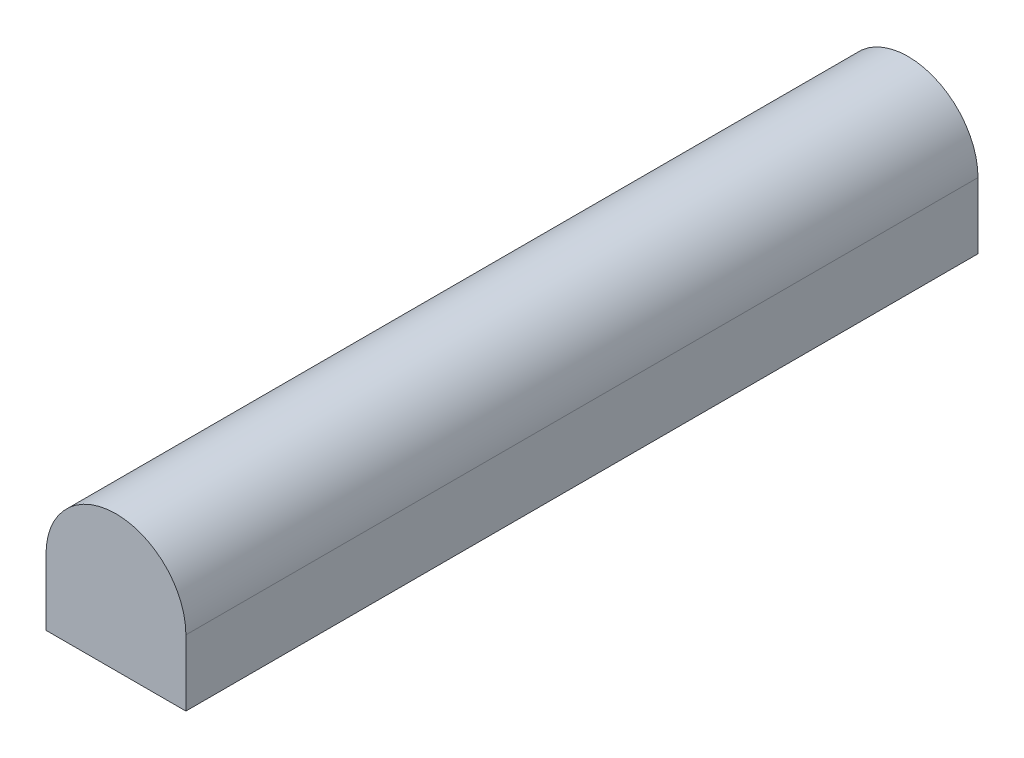
ISO-10303-21;
HEADER;
FILE_DESCRIPTION(('STEP AP214'),'2;1');
FILE_NAME('part.step','',(''),(''),'','','');
FILE_SCHEMA(('AUTOMOTIVE_DESIGN { 1 0 10303 214 1 1 1 1 }'));
ENDSEC;
DATA;
#1=APPLICATION_CONTEXT('core data for automotive mechanical design processes');
#2=APPLICATION_PROTOCOL_DEFINITION('international standard','automotive_design',2000,#1);
#3=PRODUCT_CONTEXT('',#1,'mechanical');
#4=PRODUCT('Part','Part','',(#3));
#5=PRODUCT_RELATED_PRODUCT_CATEGORY('part','',(#4));
#6=PRODUCT_DEFINITION_FORMATION('','',#4);
#7=PRODUCT_DEFINITION_CONTEXT('part definition',#1,'design');
#8=PRODUCT_DEFINITION('design','',#6,#7);
#9=PRODUCT_DEFINITION_SHAPE('','',#8);
#10=(LENGTH_UNIT() NAMED_UNIT(*) SI_UNIT(.MILLI.,.METRE.));
#11=(NAMED_UNIT(*) PLANE_ANGLE_UNIT() SI_UNIT($,.RADIAN.));
#12=(NAMED_UNIT(*) SI_UNIT($,.STERADIAN.) SOLID_ANGLE_UNIT());
#13=UNCERTAINTY_MEASURE_WITH_UNIT(LENGTH_MEASURE(1.E-05),#10,'distance_accuracy_value','');
#14=(GEOMETRIC_REPRESENTATION_CONTEXT(3) GLOBAL_UNCERTAINTY_ASSIGNED_CONTEXT((#13)) GLOBAL_UNIT_ASSIGNED_CONTEXT((#10,
#11,#12)) REPRESENTATION_CONTEXT('',''));
#15=CARTESIAN_POINT('',(0.,0.,0.));
#16=DIRECTION('',(0.,0.,1.));
#17=DIRECTION('',(1.,0.,0.));
#18=AXIS2_PLACEMENT_3D('',#15,#16,#17);
#19=CARTESIAN_POINT('',(0.,-2.4218862927476E-13,-18288.00254));
#20=DIRECTION('',(0.,0.,1.));
#21=DIRECTION('',(1.,0.,0.));
#22=AXIS2_PLACEMENT_3D('',#19,#20,#21);
#23=CYLINDRICAL_SURFACE('',#22,1614.96756);
#24=CARTESIAN_POINT('',(0.,-2.4218862927476E-13,-18288.));
#25=DIRECTION('',(0.,0.,-1.));
#26=DIRECTION('',(1.,0.,0.));
#27=AXIS2_PLACEMENT_3D('',#24,#25,#26);
#28=CIRCLE('',#27,1614.96756);
#29=CARTESIAN_POINT('',(-1614.96756,1.97776485308081E-13,-18288.));
#30=VERTEX_POINT('',#29);
#31=CARTESIAN_POINT('',(1614.96756,1.97776056219685E-13,-18288.));
#32=VERTEX_POINT('',#31);
#33=EDGE_CURVE('E108',#30,#32,#28,.T.);
#34=ORIENTED_EDGE('',*,*,#33,.T.);
#35=DIRECTION('',(0.,0.,1.));
#36=VECTOR('',#35,1.);
#37=CARTESIAN_POINT('',(1614.96756,1.97776056219685E-13,-18288.00254));
#38=LINE('',#37,#36);
#39=CARTESIAN_POINT('',(1614.96756,1.97776056219685E-13,-18288.00254));
#40=VERTEX_POINT('',#39);
#41=EDGE_CURVE('E12',#40,#32,#38,.T.);
#42=ORIENTED_EDGE('',*,*,#41,.F.);
#43=CARTESIAN_POINT('',(0.,-2.4218862927476E-13,-18288.00254));
#44=DIRECTION('',(0.,0.,-1.));
#45=DIRECTION('',(1.,0.,0.));
#46=AXIS2_PLACEMENT_3D('',#43,#44,#45);
#47=CIRCLE('',#46,1614.96756);
#48=CARTESIAN_POINT('',(-1614.96756,1.97776485308081E-13,-18288.00254));
#49=VERTEX_POINT('',#48);
#50=EDGE_CURVE('E96',#49,#40,#47,.T.);
#51=ORIENTED_EDGE('',*,*,#50,.F.);
#52=DIRECTION('',(0.,0.,1.));
#53=VECTOR('',#52,1.);
#54=CARTESIAN_POINT('',(-1614.96756,1.97776485308081E-13,-18288.00254));
#55=LINE('',#54,#53);
#56=EDGE_CURVE('E104',#49,#30,#55,.T.);
#57=ORIENTED_EDGE('',*,*,#56,.T.);
#58=EDGE_LOOP('',(#34,#42,#51,#57));
#59=FACE_BOUND('',#58,.T.);
#60=ADVANCED_FACE('F45',(#59),#23,.T.);
#61=CARTESIAN_POINT('',(1614.96756,1.97776056219685E-13,-18288.00254));
#62=DIRECTION('',(-1.,0.,0.));
#63=DIRECTION('',(0.,-1.,0.));
#64=AXIS2_PLACEMENT_3D('',#61,#62,#63);
#65=PLANE('',#64);
#66=DIRECTION('',(0.,-1.,0.));
#67=VECTOR('',#66,1.);
#68=CARTESIAN_POINT('',(1614.96756,1.97776056219685E-13,-18288.));
#69=LINE('',#68,#67);
#70=CARTESIAN_POINT('',(1614.96756,-1524.,-18288.));
#71=VERTEX_POINT('',#70);
#72=EDGE_CURVE('E100',#32,#71,#69,.T.);
#73=ORIENTED_EDGE('',*,*,#72,.T.);
#74=DIRECTION('',(0.,0.,1.));
#75=VECTOR('',#74,1.);
#76=CARTESIAN_POINT('',(1614.96756,-1524.,-18288.00254));
#77=LINE('',#76,#75);
#78=CARTESIAN_POINT('',(1614.96756,-1524.,-18288.00254));
#79=VERTEX_POINT('',#78);
#80=EDGE_CURVE('E53',#79,#71,#77,.T.);
#81=ORIENTED_EDGE('',*,*,#80,.F.);
#82=DIRECTION('',(0.,-1.,0.));
#83=VECTOR('',#82,1.);
#84=CARTESIAN_POINT('',(1614.96756,1.97776056219685E-13,-18288.00254));
#85=LINE('',#84,#83);
#86=EDGE_CURVE('E91',#40,#79,#85,.T.);
#87=ORIENTED_EDGE('',*,*,#86,.F.);
#88=ORIENTED_EDGE('',*,*,#41,.T.);
#89=EDGE_LOOP('',(#73,#81,#87,#88));
#90=FACE_BOUND('',#89,.T.);
#91=ADVANCED_FACE('F99',(#90),#65,.F.);
#92=CARTESIAN_POINT('',(1614.96756,-1524.,-18288.00254));
#93=DIRECTION('',(0.,1.,0.));
#94=DIRECTION('',(-1.,0.,0.));
#95=AXIS2_PLACEMENT_3D('',#92,#93,#94);
#96=PLANE('',#95);
#97=DIRECTION('',(-1.,0.,0.));
#98=VECTOR('',#97,1.);
#99=CARTESIAN_POINT('',(1614.96756,-1524.,-18288.));
#100=LINE('',#99,#98);
#101=CARTESIAN_POINT('',(-1614.96756,-1524.,-18288.));
#102=VERTEX_POINT('',#101);
#103=EDGE_CURVE('E78',#71,#102,#100,.T.);
#104=ORIENTED_EDGE('',*,*,#103,.T.);
#105=DIRECTION('',(0.,0.,1.));
#106=VECTOR('',#105,1.);
#107=CARTESIAN_POINT('',(-1614.96756,-1524.,-18288.00254));
#108=LINE('',#107,#106);
#109=CARTESIAN_POINT('',(-1614.96756,-1524.,-18288.00254));
#110=VERTEX_POINT('',#109);
#111=EDGE_CURVE('E101',#110,#102,#108,.T.);
#112=ORIENTED_EDGE('',*,*,#111,.F.);
#113=DIRECTION('',(-1.,0.,0.));
#114=VECTOR('',#113,1.);
#115=CARTESIAN_POINT('',(1614.96756,-1524.,-18288.00254));
#116=LINE('',#115,#114);
#117=EDGE_CURVE('E94',#79,#110,#116,.T.);
#118=ORIENTED_EDGE('',*,*,#117,.F.);
#119=ORIENTED_EDGE('',*,*,#80,.T.);
#120=EDGE_LOOP('',(#104,#112,#118,#119));
#121=FACE_BOUND('',#120,.T.);
#122=ADVANCED_FACE('F102',(#121),#96,.F.);
#123=CARTESIAN_POINT('',(-1614.96756,-1524.,-18288.00254));
#124=DIRECTION('',(1.,0.,0.));
#125=DIRECTION('',(0.,0.,-1.));
#126=AXIS2_PLACEMENT_3D('',#123,#124,#125);
#127=PLANE('',#126);
#128=DIRECTION('',(0.,1.,0.));
#129=VECTOR('',#128,1.);
#130=CARTESIAN_POINT('',(-1614.96756,-1524.,-18288.));
#131=LINE('',#130,#129);
#132=EDGE_CURVE('E84',#102,#30,#131,.T.);
#133=ORIENTED_EDGE('',*,*,#132,.T.);
#134=ORIENTED_EDGE('',*,*,#56,.F.);
#135=DIRECTION('',(0.,1.,0.));
#136=VECTOR('',#135,1.);
#137=CARTESIAN_POINT('',(-1614.96756,-1524.,-18288.00254));
#138=LINE('',#137,#136);
#139=EDGE_CURVE('E61',#110,#49,#138,.T.);
#140=ORIENTED_EDGE('',*,*,#139,.F.);
#141=ORIENTED_EDGE('',*,*,#111,.T.);
#142=EDGE_LOOP('',(#133,#134,#140,#141));
#143=FACE_BOUND('',#142,.T.);
#144=ADVANCED_FACE('F115',(#143),#127,.F.);
#145=CARTESIAN_POINT('',(0.,-2.4218862927476E-13,-18288.00254));
#146=DIRECTION('',(0.,0.,1.));
#147=DIRECTION('',(1.,0.,0.));
#148=AXIS2_PLACEMENT_3D('',#145,#146,#147);
#149=PLANE('',#148);
#150=ORIENTED_EDGE('',*,*,#50,.T.);
#151=ORIENTED_EDGE('',*,*,#86,.T.);
#152=ORIENTED_EDGE('',*,*,#117,.T.);
#153=ORIENTED_EDGE('',*,*,#139,.T.);
#154=EDGE_LOOP('',(#150,#151,#152,#153));
#155=FACE_BOUND('',#154,.T.);
#156=ADVANCED_FACE('F92',(#155),#149,.F.);
#157=CARTESIAN_POINT('',(0.,-2.4218862927476E-13,-18288.));
#158=DIRECTION('',(0.,0.,1.));
#159=DIRECTION('',(1.,0.,0.));
#160=AXIS2_PLACEMENT_3D('',#157,#158,#159);
#161=PLANE('',#160);
#162=ORIENTED_EDGE('',*,*,#33,.F.);
#163=ORIENTED_EDGE('',*,*,#132,.F.);
#164=ORIENTED_EDGE('',*,*,#103,.F.);
#165=ORIENTED_EDGE('',*,*,#72,.F.);
#166=EDGE_LOOP('',(#162,#163,#164,#165));
#167=FACE_BOUND('',#166,.T.);
#168=ADVANCED_FACE('F118',(#167),#161,.T.);
#169=CLOSED_SHELL('',(#60,#91,#122,#144,#156,#168));
#170=MANIFOLD_SOLID_BREP('B2',#169);
#171=CARTESIAN_POINT('',(1614.96756,3.95552852588053E-13,-18288.));
#172=DIRECTION('',(-1.,0.,0.));
#173=DIRECTION('',(0.,-1.,0.));
#174=AXIS2_PLACEMENT_3D('',#171,#172,#173);
#175=PLANE('',#174);
#176=DIRECTION('',(0.,-1.,0.));
#177=VECTOR('',#176,1.);
#178=CARTESIAN_POINT('',(1614.96756,3.95552852588053E-13,-0.00254000000055044));
#179=LINE('',#178,#177);
#180=CARTESIAN_POINT('',(1614.96756,1.97776056219685E-13,-0.00254000000055044));
#181=VERTEX_POINT('',#180);
#182=CARTESIAN_POINT('',(1614.96756,-1524.,-0.00254));
#183=VERTEX_POINT('',#182);
#184=EDGE_CURVE('E266',#181,#183,#179,.T.);
#185=ORIENTED_EDGE('',*,*,#184,.F.);
#186=DIRECTION('',(0.,0.,1.));
#187=VECTOR('',#186,1.);
#188=CARTESIAN_POINT('',(1614.96756,1.97776056219685E-13,-18288.));
#189=LINE('',#188,#187);
#190=CARTESIAN_POINT('',(1614.96756,1.97776056219685E-13,-18288.));
#191=VERTEX_POINT('',#190);
#192=EDGE_CURVE('E43',#191,#181,#189,.T.);
#193=ORIENTED_EDGE('',*,*,#192,.F.);
#194=DIRECTION('',(0.,-1.,0.));
#195=VECTOR('',#194,1.);
#196=CARTESIAN_POINT('',(1614.96756,3.95552852588053E-13,-18288.));
#197=LINE('',#196,#195);
#198=CARTESIAN_POINT('',(1614.96756,-1524.,-18288.));
#199=VERTEX_POINT('',#198);
#200=EDGE_CURVE('E270',#191,#199,#197,.T.);
#201=ORIENTED_EDGE('',*,*,#200,.T.);
#202=DIRECTION('',(0.,0.,1.));
#203=VECTOR('',#202,1.);
#204=CARTESIAN_POINT('',(1614.96756,-1524.,-18288.));
#205=LINE('',#204,#203);
#206=EDGE_CURVE('E172',#199,#183,#205,.T.);
#207=ORIENTED_EDGE('',*,*,#206,.T.);
#208=EDGE_LOOP('',(#185,#193,#201,#207));
#209=FACE_BOUND('',#208,.T.);
#210=ADVANCED_FACE('F169',(#209),#175,.T.);
#211=CARTESIAN_POINT('',(0.,0.,-18288.));
#212=DIRECTION('',(0.,0.,1.));
#213=DIRECTION('',(1.,0.,0.));
#214=AXIS2_PLACEMENT_3D('',#211,#212,#213);
#215=CYLINDRICAL_SURFACE('',#214,1614.96756);
#216=CARTESIAN_POINT('',(0.,0.,-0.00254000000055044));
#217=DIRECTION('',(0.,0.,-1.));
#218=DIRECTION('',(-1.,0.,0.));
#219=AXIS2_PLACEMENT_3D('',#216,#217,#218);
#220=CIRCLE('',#219,1614.96756);
#221=CARTESIAN_POINT('',(-1614.96756,1.97776485308081E-13,-0.00254));
#222=VERTEX_POINT('',#221);
#223=EDGE_CURVE('E285',#222,#181,#220,.T.);
#224=ORIENTED_EDGE('',*,*,#223,.F.);
#225=DIRECTION('',(0.,0.,1.));
#226=VECTOR('',#225,1.);
#227=CARTESIAN_POINT('',(-1614.96756,1.97776485308081E-13,-18288.));
#228=LINE('',#227,#226);
#229=CARTESIAN_POINT('',(-1614.96756,1.97776485308081E-13,-18288.));
#230=VERTEX_POINT('',#229);
#231=EDGE_CURVE('E178',#230,#222,#228,.T.);
#232=ORIENTED_EDGE('',*,*,#231,.F.);
#233=CARTESIAN_POINT('',(0.,0.,-18288.));
#234=DIRECTION('',(0.,0.,1.));
#235=DIRECTION('',(1.,0.,0.));
#236=AXIS2_PLACEMENT_3D('',#233,#234,#235);
#237=CIRCLE('',#236,1614.96756);
#238=EDGE_CURVE('E257',#230,#191,#237,.F.);
#239=ORIENTED_EDGE('',*,*,#238,.T.);
#240=ORIENTED_EDGE('',*,*,#192,.T.);
#241=EDGE_LOOP('',(#224,#232,#239,#240));
#242=FACE_BOUND('',#241,.T.);
#243=ADVANCED_FACE('F320',(#242),#215,.F.);
#244=CARTESIAN_POINT('',(-1614.96756,0.,-18288.));
#245=DIRECTION('',(1.,0.,0.));
#246=DIRECTION('',(0.,0.,-1.));
#247=AXIS2_PLACEMENT_3D('',#244,#245,#246);
#248=PLANE('',#247);
#249=DIRECTION('',(0.,-1.,0.));
#250=VECTOR('',#249,1.);
#251=CARTESIAN_POINT('',(-1614.96756,1.97776485308081E-13,-0.00254));
#252=LINE('',#251,#250);
#253=CARTESIAN_POINT('',(-1614.96756,-1524.,-0.00254));
#254=VERTEX_POINT('',#253);
#255=EDGE_CURVE('E246',#222,#254,#252,.T.);
#256=ORIENTED_EDGE('',*,*,#255,.T.);
#257=DIRECTION('',(0.,0.,1.));
#258=VECTOR('',#257,1.);
#259=CARTESIAN_POINT('',(-1614.96756,-1524.,-18288.));
#260=LINE('',#259,#258);
#261=CARTESIAN_POINT('',(-1614.96756,-1524.,-18288.));
#262=VERTEX_POINT('',#261);
#263=EDGE_CURVE('E237',#262,#254,#260,.T.);
#264=ORIENTED_EDGE('',*,*,#263,.F.);
#265=DIRECTION('',(0.,1.,0.));
#266=VECTOR('',#265,1.);
#267=CARTESIAN_POINT('',(-1614.96756,0.,-18288.));
#268=LINE('',#267,#266);
#269=EDGE_CURVE('E242',#262,#230,#268,.T.);
#270=ORIENTED_EDGE('',*,*,#269,.T.);
#271=ORIENTED_EDGE('',*,*,#231,.T.);
#272=EDGE_LOOP('',(#256,#264,#270,#271));
#273=FACE_BOUND('',#272,.T.);
#274=ADVANCED_FACE('F239',(#273),#248,.T.);
#275=CARTESIAN_POINT('',(-1614.96756,-1524.,-18288.));
#276=DIRECTION('',(0.,1.,0.));
#277=DIRECTION('',(0.,0.,1.));
#278=AXIS2_PLACEMENT_3D('',#275,#276,#277);
#279=PLANE('',#278);
#280=DIRECTION('',(-1.,0.,0.));
#281=VECTOR('',#280,1.);
#282=CARTESIAN_POINT('',(-1614.96756,-1524.,0.));
#283=LINE('',#282,#281);
#284=CARTESIAN_POINT('',(1614.9701,-1524.,0.));
#285=VERTEX_POINT('',#284);
#286=CARTESIAN_POINT('',(-1614.9701,-1524.,0.));
#287=VERTEX_POINT('',#286);
#288=EDGE_CURVE('E211',#285,#287,#283,.T.);
#289=ORIENTED_EDGE('',*,*,#288,.T.);
#290=DIRECTION('',(0.,0.,1.));
#291=VECTOR('',#290,1.);
#292=CARTESIAN_POINT('',(-1614.9701,-1524.,-18288.));
#293=LINE('',#292,#291);
#294=CARTESIAN_POINT('',(-1614.9701,-1524.,-18288.));
#295=VERTEX_POINT('',#294);
#296=EDGE_CURVE('E248',#295,#287,#293,.T.);
#297=ORIENTED_EDGE('',*,*,#296,.F.);
#298=DIRECTION('',(-1.,0.,0.));
#299=VECTOR('',#298,1.);
#300=CARTESIAN_POINT('',(-1614.96756,-1524.,-18288.));
#301=LINE('',#300,#299);
#302=EDGE_CURVE('E250',#262,#295,#301,.T.);
#303=ORIENTED_EDGE('',*,*,#302,.F.);
#304=ORIENTED_EDGE('',*,*,#263,.T.);
#305=DIRECTION('',(1.,0.,0.));
#306=VECTOR('',#305,1.);
#307=CARTESIAN_POINT('',(1614.9701,-1524.,-0.00254));
#308=LINE('',#307,#306);
#309=EDGE_CURVE('E283',#254,#183,#308,.T.);
#310=ORIENTED_EDGE('',*,*,#309,.T.);
#311=ORIENTED_EDGE('',*,*,#206,.F.);
#312=DIRECTION('',(-1.,0.,0.));
#313=VECTOR('',#312,1.);
#314=CARTESIAN_POINT('',(1614.9701,-1524.,-18288.));
#315=LINE('',#314,#313);
#316=CARTESIAN_POINT('',(1614.9701,-1524.,-18288.));
#317=VERTEX_POINT('',#316);
#318=EDGE_CURVE('E218',#317,#199,#315,.T.);
#319=ORIENTED_EDGE('',*,*,#318,.F.);
#320=DIRECTION('',(0.,0.,1.));
#321=VECTOR('',#320,1.);
#322=CARTESIAN_POINT('',(1614.9701,-1524.,-18288.));
#323=LINE('',#322,#321);
#324=EDGE_CURVE('E277',#317,#285,#323,.T.);
#325=ORIENTED_EDGE('',*,*,#324,.T.);
#326=EDGE_LOOP('',(#289,#297,#303,#304,#310,#311,#319,#325));
#327=FACE_BOUND('',#326,.T.);
#328=ADVANCED_FACE('F251',(#327),#279,.F.);
#329=CARTESIAN_POINT('',(-1614.9701,0.,-18288.));
#330=DIRECTION('',(1.,0.,0.));
#331=DIRECTION('',(0.,0.,-1.));
#332=AXIS2_PLACEMENT_3D('',#329,#330,#331);
#333=PLANE('',#332);
#334=DIRECTION('',(0.,1.,0.));
#335=VECTOR('',#334,1.);
#336=CARTESIAN_POINT('',(-1614.9701,0.,0.));
#337=LINE('',#336,#335);
#338=CARTESIAN_POINT('',(-1614.9701,0.,0.));
#339=VERTEX_POINT('',#338);
#340=EDGE_CURVE('E204',#287,#339,#337,.T.);
#341=ORIENTED_EDGE('',*,*,#340,.T.);
#342=DIRECTION('',(0.,0.,1.));
#343=VECTOR('',#342,1.);
#344=CARTESIAN_POINT('',(-1614.9701,0.,-18288.));
#345=LINE('',#344,#343);
#346=CARTESIAN_POINT('',(-1614.9701,0.,-18288.));
#347=VERTEX_POINT('',#346);
#348=EDGE_CURVE('E274',#347,#339,#345,.T.);
#349=ORIENTED_EDGE('',*,*,#348,.F.);
#350=DIRECTION('',(0.,1.,0.));
#351=VECTOR('',#350,1.);
#352=CARTESIAN_POINT('',(-1614.9701,0.,-18288.));
#353=LINE('',#352,#351);
#354=EDGE_CURVE('E253',#295,#347,#353,.T.);
#355=ORIENTED_EDGE('',*,*,#354,.F.);
#356=ORIENTED_EDGE('',*,*,#296,.T.);
#357=EDGE_LOOP('',(#341,#349,#355,#356));
#358=FACE_BOUND('',#357,.T.);
#359=ADVANCED_FACE('F299',(#358),#333,.F.);
#360=CARTESIAN_POINT('',(0.,0.,-18288.));
#361=DIRECTION('',(0.,0.,1.));
#362=DIRECTION('',(1.,0.,0.));
#363=AXIS2_PLACEMENT_3D('',#360,#361,#362);
#364=CYLINDRICAL_SURFACE('',#363,1614.9701);
#365=CARTESIAN_POINT('',(0.,0.,0.));
#366=DIRECTION('',(0.,0.,-1.));
#367=DIRECTION('',(-1.,0.,0.));
#368=AXIS2_PLACEMENT_3D('',#365,#366,#367);
#369=CIRCLE('',#368,1614.9701);
#370=CARTESIAN_POINT('',(1614.9701,1.97776796368368E-13,0.));
#371=VERTEX_POINT('',#370);
#372=EDGE_CURVE('E265',#339,#371,#369,.T.);
#373=ORIENTED_EDGE('',*,*,#372,.T.);
#374=DIRECTION('',(0.,0.,1.));
#375=VECTOR('',#374,1.);
#376=CARTESIAN_POINT('',(1614.9701,1.97776796368368E-13,-18288.));
#377=LINE('',#376,#375);
#378=CARTESIAN_POINT('',(1614.9701,1.97776796368368E-13,-18288.));
#379=VERTEX_POINT('',#378);
#380=EDGE_CURVE('E276',#379,#371,#377,.T.);
#381=ORIENTED_EDGE('',*,*,#380,.F.);
#382=CARTESIAN_POINT('',(0.,0.,-18288.));
#383=DIRECTION('',(0.,0.,-1.));
#384=DIRECTION('',(-1.,0.,0.));
#385=AXIS2_PLACEMENT_3D('',#382,#383,#384);
#386=CIRCLE('',#385,1614.9701);
#387=EDGE_CURVE('E296',#347,#379,#386,.T.);
#388=ORIENTED_EDGE('',*,*,#387,.F.);
#389=ORIENTED_EDGE('',*,*,#348,.T.);
#390=EDGE_LOOP('',(#373,#381,#388,#389));
#391=FACE_BOUND('',#390,.T.);
#392=ADVANCED_FACE('F302',(#391),#364,.T.);
#393=CARTESIAN_POINT('',(1614.9701,3.95553592736736E-13,-18288.));
#394=DIRECTION('',(-1.,0.,0.));
#395=DIRECTION('',(0.,-1.,0.));
#396=AXIS2_PLACEMENT_3D('',#393,#394,#395);
#397=PLANE('',#396);
#398=ORIENTED_EDGE('',*,*,#380,.T.);
#399=DIRECTION('',(0.,-1.,0.));
#400=VECTOR('',#399,1.);
#401=CARTESIAN_POINT('',(1614.9701,3.95553592736736E-13,0.));
#402=LINE('',#401,#400);
#403=EDGE_CURVE('E262',#371,#285,#402,.T.);
#404=ORIENTED_EDGE('',*,*,#403,.T.);
#405=ORIENTED_EDGE('',*,*,#324,.F.);
#406=DIRECTION('',(0.,-1.,0.));
#407=VECTOR('',#406,1.);
#408=CARTESIAN_POINT('',(1614.9701,3.95553592736736E-13,-18288.));
#409=LINE('',#408,#407);
#410=EDGE_CURVE('E294',#379,#317,#409,.T.);
#411=ORIENTED_EDGE('',*,*,#410,.F.);
#412=EDGE_LOOP('',(#398,#404,#405,#411));
#413=FACE_BOUND('',#412,.T.);
#414=ADVANCED_FACE('F306',(#413),#397,.F.);
#415=CARTESIAN_POINT('',(0.,0.,-18288.));
#416=DIRECTION('',(0.,0.,-1.));
#417=DIRECTION('',(-1.,0.,0.));
#418=AXIS2_PLACEMENT_3D('',#415,#416,#417);
#419=PLANE('',#418);
#420=ORIENTED_EDGE('',*,*,#200,.F.);
#421=ORIENTED_EDGE('',*,*,#238,.F.);
#422=ORIENTED_EDGE('',*,*,#269,.F.);
#423=ORIENTED_EDGE('',*,*,#302,.T.);
#424=ORIENTED_EDGE('',*,*,#354,.T.);
#425=ORIENTED_EDGE('',*,*,#387,.T.);
#426=ORIENTED_EDGE('',*,*,#410,.T.);
#427=ORIENTED_EDGE('',*,*,#318,.T.);
#428=EDGE_LOOP('',(#420,#421,#422,#423,#424,#425,#426,#427));
#429=FACE_BOUND('',#428,.T.);
#430=ADVANCED_FACE('F255',(#429),#419,.T.);
#431=CARTESIAN_POINT('',(0.,0.,0.));
#432=DIRECTION('',(0.,0.,-1.));
#433=DIRECTION('',(-1.,0.,0.));
#434=AXIS2_PLACEMENT_3D('',#431,#432,#433);
#435=PLANE('',#434);
#436=ORIENTED_EDGE('',*,*,#288,.F.);
#437=ORIENTED_EDGE('',*,*,#403,.F.);
#438=ORIENTED_EDGE('',*,*,#372,.F.);
#439=ORIENTED_EDGE('',*,*,#340,.F.);
#440=EDGE_LOOP('',(#436,#437,#438,#439));
#441=FACE_BOUND('',#440,.T.);
#442=ADVANCED_FACE('F308',(#441),#435,.F.);
#443=CARTESIAN_POINT('',(0.00127000000005317,4.16139861396966E-13,-0.00254));
#444=DIRECTION('',(0.,0.,-1.));
#445=DIRECTION('',(-1.,0.,0.));
#446=AXIS2_PLACEMENT_3D('',#443,#444,#445);
#447=PLANE('',#446);
#448=ORIENTED_EDGE('',*,*,#223,.T.);
#449=ORIENTED_EDGE('',*,*,#184,.T.);
#450=ORIENTED_EDGE('',*,*,#309,.F.);
#451=ORIENTED_EDGE('',*,*,#255,.F.);
#452=EDGE_LOOP('',(#448,#449,#450,#451));
#453=FACE_BOUND('',#452,.T.);
#454=ADVANCED_FACE('F310',(#453),#447,.T.);
#455=CLOSED_SHELL('',(#210,#243,#274,#328,#359,#392,#414,#430,#442,#454));
#456=MANIFOLD_SOLID_BREP('B6',#455);
#457=ADVANCED_BREP_SHAPE_REPRESENTATION('',(#18,#170,#456),#14);
#458=SHAPE_DEFINITION_REPRESENTATION(#9,#457);
ENDSEC;
END-ISO-10303-21;
